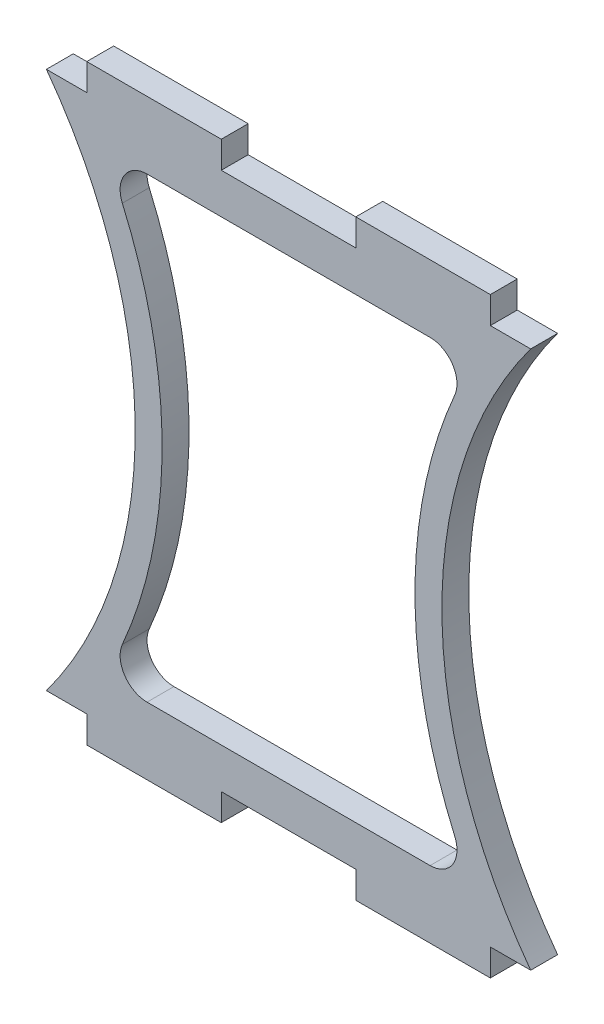
ISO-10303-21;
HEADER;
FILE_DESCRIPTION(('STEP AP214'),'2;1');
FILE_NAME('part.step','',(''),(''),'','','');
FILE_SCHEMA(('AUTOMOTIVE_DESIGN { 1 0 10303 214 1 1 1 1 }'));
ENDSEC;
DATA;
#1=APPLICATION_CONTEXT('core data for automotive mechanical design processes');
#2=APPLICATION_PROTOCOL_DEFINITION('international standard','automotive_design',2000,#1);
#3=PRODUCT_CONTEXT('',#1,'mechanical');
#4=PRODUCT('Part','Part','',(#3));
#5=PRODUCT_RELATED_PRODUCT_CATEGORY('part','',(#4));
#6=PRODUCT_DEFINITION_FORMATION('','',#4);
#7=PRODUCT_DEFINITION_CONTEXT('part definition',#1,'design');
#8=PRODUCT_DEFINITION('design','',#6,#7);
#9=PRODUCT_DEFINITION_SHAPE('','',#8);
#10=(LENGTH_UNIT() NAMED_UNIT(*) SI_UNIT(.MILLI.,.METRE.));
#11=(NAMED_UNIT(*) PLANE_ANGLE_UNIT() SI_UNIT($,.RADIAN.));
#12=(NAMED_UNIT(*) SI_UNIT($,.STERADIAN.) SOLID_ANGLE_UNIT());
#13=UNCERTAINTY_MEASURE_WITH_UNIT(LENGTH_MEASURE(1.E-05),#10,'distance_accuracy_value','');
#14=(GEOMETRIC_REPRESENTATION_CONTEXT(3) GLOBAL_UNCERTAINTY_ASSIGNED_CONTEXT((#13)) GLOBAL_UNIT_ASSIGNED_CONTEXT((#10,
#11,#12)) REPRESENTATION_CONTEXT('',''));
#15=CARTESIAN_POINT('',(0.,0.,0.));
#16=DIRECTION('',(0.,0.,1.));
#17=DIRECTION('',(1.,0.,0.));
#18=AXIS2_PLACEMENT_3D('',#15,#16,#17);
#19=CARTESIAN_POINT('',(45.,0.,2.));
#20=DIRECTION('',(0.,0.,1.));
#21=DIRECTION('',(1.,0.,0.));
#22=AXIS2_PLACEMENT_3D('',#19,#20,#21);
#23=PLANE('',#22);
#24=CARTESIAN_POINT('',(45.,0.,2.));
#25=DIRECTION('',(0.,0.,-1.));
#26=DIRECTION('',(1.,0.,0.));
#27=AXIS2_PLACEMENT_3D('',#24,#25,#26);
#28=CIRCLE('',#27,33.6005952328229);
#29=CARTESIAN_POINT('',(18.,-20.,2.));
#30=VERTEX_POINT('',#29);
#31=CARTESIAN_POINT('',(18.,20.,2.));
#32=VERTEX_POINT('',#31);
#33=EDGE_CURVE('E284',#30,#32,#28,.T.);
#34=ORIENTED_EDGE('',*,*,#33,.T.);
#35=DIRECTION('',(-1.,0.,0.));
#36=VECTOR('',#35,1.);
#37=CARTESIAN_POINT('',(15.,20.,2.));
#38=LINE('',#37,#36);
#39=CARTESIAN_POINT('',(15.,20.,2.));
#40=VERTEX_POINT('',#39);
#41=EDGE_CURVE('E287',#32,#40,#38,.T.);
#42=ORIENTED_EDGE('',*,*,#41,.T.);
#43=DIRECTION('',(0.,1.,0.));
#44=VECTOR('',#43,1.);
#45=CARTESIAN_POINT('',(15.,22.,2.));
#46=LINE('',#45,#44);
#47=CARTESIAN_POINT('',(15.,22.,2.));
#48=VERTEX_POINT('',#47);
#49=EDGE_CURVE('E290',#40,#48,#46,.T.);
#50=ORIENTED_EDGE('',*,*,#49,.T.);
#51=DIRECTION('',(-1.,0.,0.));
#52=VECTOR('',#51,1.);
#53=CARTESIAN_POINT('',(5.,22.,2.));
#54=LINE('',#53,#52);
#55=CARTESIAN_POINT('',(5.,22.,2.));
#56=VERTEX_POINT('',#55);
#57=EDGE_CURVE('E292',#48,#56,#54,.T.);
#58=ORIENTED_EDGE('',*,*,#57,.T.);
#59=DIRECTION('',(0.,-1.,0.));
#60=VECTOR('',#59,1.);
#61=CARTESIAN_POINT('',(5.,20.,2.));
#62=LINE('',#61,#60);
#63=CARTESIAN_POINT('',(5.,20.,2.));
#64=VERTEX_POINT('',#63);
#65=EDGE_CURVE('E294',#56,#64,#62,.T.);
#66=ORIENTED_EDGE('',*,*,#65,.T.);
#67=DIRECTION('',(-1.,0.,0.));
#68=VECTOR('',#67,1.);
#69=CARTESIAN_POINT('',(-5.,20.,2.));
#70=LINE('',#69,#68);
#71=CARTESIAN_POINT('',(-5.,20.,2.));
#72=VERTEX_POINT('',#71);
#73=EDGE_CURVE('E296',#64,#72,#70,.T.);
#74=ORIENTED_EDGE('',*,*,#73,.T.);
#75=DIRECTION('',(0.,1.,0.));
#76=VECTOR('',#75,1.);
#77=CARTESIAN_POINT('',(-5.,20.,2.));
#78=LINE('',#77,#76);
#79=CARTESIAN_POINT('',(-5.,22.,2.));
#80=VERTEX_POINT('',#79);
#81=EDGE_CURVE('E298',#72,#80,#78,.T.);
#82=ORIENTED_EDGE('',*,*,#81,.T.);
#83=DIRECTION('',(-1.,0.,0.));
#84=VECTOR('',#83,1.);
#85=CARTESIAN_POINT('',(-5.,22.,2.));
#86=LINE('',#85,#84);
#87=CARTESIAN_POINT('',(-15.,22.,2.));
#88=VERTEX_POINT('',#87);
#89=EDGE_CURVE('E300',#80,#88,#86,.T.);
#90=ORIENTED_EDGE('',*,*,#89,.T.);
#91=DIRECTION('',(0.,-1.,0.));
#92=VECTOR('',#91,1.);
#93=CARTESIAN_POINT('',(-15.,22.,2.));
#94=LINE('',#93,#92);
#95=CARTESIAN_POINT('',(-15.,20.,2.));
#96=VERTEX_POINT('',#95);
#97=EDGE_CURVE('E302',#88,#96,#94,.T.);
#98=ORIENTED_EDGE('',*,*,#97,.T.);
#99=DIRECTION('',(-1.,0.,0.));
#100=VECTOR('',#99,1.);
#101=CARTESIAN_POINT('',(-18.,20.,2.));
#102=LINE('',#101,#100);
#103=CARTESIAN_POINT('',(-18.,20.,2.));
#104=VERTEX_POINT('',#103);
#105=EDGE_CURVE('E304',#96,#104,#102,.T.);
#106=ORIENTED_EDGE('',*,*,#105,.T.);
#107=CARTESIAN_POINT('',(-45.,0.,2.));
#108=DIRECTION('',(0.,0.,-1.));
#109=DIRECTION('',(-1.,0.,0.));
#110=AXIS2_PLACEMENT_3D('',#107,#108,#109);
#111=CIRCLE('',#110,33.6005952328229);
#112=CARTESIAN_POINT('',(-18.,-20.,2.));
#113=VERTEX_POINT('',#112);
#114=EDGE_CURVE('E306',#104,#113,#111,.T.);
#115=ORIENTED_EDGE('',*,*,#114,.T.);
#116=DIRECTION('',(1.,0.,0.));
#117=VECTOR('',#116,1.);
#118=CARTESIAN_POINT('',(-18.,-20.,2.));
#119=LINE('',#118,#117);
#120=CARTESIAN_POINT('',(-15.,-20.,2.));
#121=VERTEX_POINT('',#120);
#122=EDGE_CURVE('E308',#113,#121,#119,.T.);
#123=ORIENTED_EDGE('',*,*,#122,.T.);
#124=DIRECTION('',(0.,-1.,0.));
#125=VECTOR('',#124,1.);
#126=CARTESIAN_POINT('',(-15.,-22.,2.));
#127=LINE('',#126,#125);
#128=CARTESIAN_POINT('',(-15.,-22.,2.));
#129=VERTEX_POINT('',#128);
#130=EDGE_CURVE('E310',#121,#129,#127,.T.);
#131=ORIENTED_EDGE('',*,*,#130,.T.);
#132=DIRECTION('',(1.,0.,0.));
#133=VECTOR('',#132,1.);
#134=CARTESIAN_POINT('',(-5.,-22.,2.));
#135=LINE('',#134,#133);
#136=CARTESIAN_POINT('',(-5.,-22.,2.));
#137=VERTEX_POINT('',#136);
#138=EDGE_CURVE('E312',#129,#137,#135,.T.);
#139=ORIENTED_EDGE('',*,*,#138,.T.);
#140=DIRECTION('',(0.,1.,0.));
#141=VECTOR('',#140,1.);
#142=CARTESIAN_POINT('',(-5.,-20.,2.));
#143=LINE('',#142,#141);
#144=CARTESIAN_POINT('',(-5.,-20.,2.));
#145=VERTEX_POINT('',#144);
#146=EDGE_CURVE('E314',#137,#145,#143,.T.);
#147=ORIENTED_EDGE('',*,*,#146,.T.);
#148=DIRECTION('',(1.,0.,0.));
#149=VECTOR('',#148,1.);
#150=CARTESIAN_POINT('',(-5.,-20.,2.));
#151=LINE('',#150,#149);
#152=CARTESIAN_POINT('',(5.,-20.,2.));
#153=VERTEX_POINT('',#152);
#154=EDGE_CURVE('E316',#145,#153,#151,.T.);
#155=ORIENTED_EDGE('',*,*,#154,.T.);
#156=DIRECTION('',(0.,-1.,0.));
#157=VECTOR('',#156,1.);
#158=CARTESIAN_POINT('',(5.,-20.,2.));
#159=LINE('',#158,#157);
#160=CARTESIAN_POINT('',(5.,-22.,2.));
#161=VERTEX_POINT('',#160);
#162=EDGE_CURVE('E318',#153,#161,#159,.T.);
#163=ORIENTED_EDGE('',*,*,#162,.T.);
#164=DIRECTION('',(1.,0.,0.));
#165=VECTOR('',#164,1.);
#166=CARTESIAN_POINT('',(5.,-22.,2.));
#167=LINE('',#166,#165);
#168=CARTESIAN_POINT('',(15.,-22.,2.));
#169=VERTEX_POINT('',#168);
#170=EDGE_CURVE('E320',#161,#169,#167,.T.);
#171=ORIENTED_EDGE('',*,*,#170,.T.);
#172=DIRECTION('',(0.,1.,0.));
#173=VECTOR('',#172,1.);
#174=CARTESIAN_POINT('',(15.,-22.,2.));
#175=LINE('',#174,#173);
#176=CARTESIAN_POINT('',(15.,-20.,2.));
#177=VERTEX_POINT('',#176);
#178=EDGE_CURVE('E322',#169,#177,#175,.T.);
#179=ORIENTED_EDGE('',*,*,#178,.T.);
#180=DIRECTION('',(1.,0.,0.));
#181=VECTOR('',#180,1.);
#182=CARTESIAN_POINT('',(15.,-20.,2.));
#183=LINE('',#182,#181);
#184=EDGE_CURVE('E324',#177,#30,#183,.T.);
#185=ORIENTED_EDGE('',*,*,#184,.T.);
#186=EDGE_LOOP('',(#34,#42,#50,#58,#66,#74,#82,#90,#98,#106,#115,#123,#131,#139,#147,#155,#163,
#171,#179,#185));
#187=FACE_BOUND('',#186,.T.);
#188=DIRECTION('',(1.,0.,0.));
#189=VECTOR('',#188,1.);
#190=CARTESIAN_POINT('',(-10.520951842277,-17.,2.));
#191=LINE('',#190,#189);
#192=CARTESIAN_POINT('',(-10.520951842277,-17.,2.));
#193=VERTEX_POINT('',#192);
#194=CARTESIAN_POINT('',(10.520951842277,-17.,2.));
#195=VERTEX_POINT('',#194);
#196=EDGE_CURVE('E227',#193,#195,#191,.T.);
#197=ORIENTED_EDGE('',*,*,#196,.F.);
#198=CARTESIAN_POINT('',(-10.520951842277,-15.,2.));
#199=DIRECTION('',(0.,0.,1.));
#200=DIRECTION('',(-1.,0.,0.));
#201=AXIS2_PLACEMENT_3D('',#198,#199,#200);
#202=CIRCLE('',#201,2.00000000000001);
#203=CARTESIAN_POINT('',(-12.3549147327168,-14.2021402902204,2.));
#204=VERTEX_POINT('',#203);
#205=EDGE_CURVE('E219',#204,#193,#202,.T.);
#206=ORIENTED_EDGE('',*,*,#205,.F.);
#207=CARTESIAN_POINT('',(-45.,0.,2.));
#208=DIRECTION('',(0.,0.,-1.));
#209=DIRECTION('',(-1.,0.,0.));
#210=AXIS2_PLACEMENT_3D('',#207,#208,#209);
#211=CIRCLE('',#210,35.6005952328229);
#212=CARTESIAN_POINT('',(-12.3549147327168,14.2021402902204,2.));
#213=VERTEX_POINT('',#212);
#214=EDGE_CURVE('E252',#213,#204,#211,.T.);
#215=ORIENTED_EDGE('',*,*,#214,.F.);
#216=CARTESIAN_POINT('',(-10.520951842277,15.,2.));
#217=DIRECTION('',(0.,0.,1.));
#218=DIRECTION('',(-1.,0.,0.));
#219=AXIS2_PLACEMENT_3D('',#216,#217,#218);
#220=CIRCLE('',#219,2.);
#221=CARTESIAN_POINT('',(-10.520951842277,17.,2.));
#222=VERTEX_POINT('',#221);
#223=EDGE_CURVE('E250',#222,#213,#220,.T.);
#224=ORIENTED_EDGE('',*,*,#223,.F.);
#225=DIRECTION('',(-1.,0.,0.));
#226=VECTOR('',#225,1.);
#227=CARTESIAN_POINT('',(-10.520951842277,17.,2.));
#228=LINE('',#227,#226);
#229=CARTESIAN_POINT('',(10.520951842277,17.,2.));
#230=VERTEX_POINT('',#229);
#231=EDGE_CURVE('E248',#230,#222,#228,.T.);
#232=ORIENTED_EDGE('',*,*,#231,.F.);
#233=CARTESIAN_POINT('',(10.520951842277,15.,2.));
#234=DIRECTION('',(0.,0.,1.));
#235=DIRECTION('',(1.,0.,0.));
#236=AXIS2_PLACEMENT_3D('',#233,#234,#235);
#237=CIRCLE('',#236,2.00000000000001);
#238=CARTESIAN_POINT('',(12.3549147327168,14.2021402902204,2.));
#239=VERTEX_POINT('',#238);
#240=EDGE_CURVE('E246',#239,#230,#237,.T.);
#241=ORIENTED_EDGE('',*,*,#240,.F.);
#242=CARTESIAN_POINT('',(45.,0.,2.));
#243=DIRECTION('',(0.,0.,-1.));
#244=DIRECTION('',(1.,0.,0.));
#245=AXIS2_PLACEMENT_3D('',#242,#243,#244);
#246=CIRCLE('',#245,35.6005952328229);
#247=CARTESIAN_POINT('',(12.3549147327168,-14.2021402902204,2.));
#248=VERTEX_POINT('',#247);
#249=EDGE_CURVE('E242',#248,#239,#246,.T.);
#250=ORIENTED_EDGE('',*,*,#249,.F.);
#251=CARTESIAN_POINT('',(10.520951842277,-15.,2.));
#252=DIRECTION('',(0.,0.,1.));
#253=DIRECTION('',(-1.,0.,0.));
#254=AXIS2_PLACEMENT_3D('',#251,#252,#253);
#255=CIRCLE('',#254,2.);
#256=EDGE_CURVE('E240',#195,#248,#255,.T.);
#257=ORIENTED_EDGE('',*,*,#256,.F.);
#258=EDGE_LOOP('',(#197,#206,#215,#224,#232,#241,#250,#257));
#259=FACE_BOUND('',#258,.T.);
#260=ADVANCED_FACE('F34',(#187,#259),#23,.T.);
#261=CARTESIAN_POINT('',(45.,0.,0.));
#262=DIRECTION('',(0.,0.,1.));
#263=DIRECTION('',(1.,0.,0.));
#264=AXIS2_PLACEMENT_3D('',#261,#262,#263);
#265=PLANE('',#264);
#266=CARTESIAN_POINT('',(45.,0.,0.));
#267=DIRECTION('',(0.,0.,-1.));
#268=DIRECTION('',(1.,0.,0.));
#269=AXIS2_PLACEMENT_3D('',#266,#267,#268);
#270=CIRCLE('',#269,33.6005952328229);
#271=CARTESIAN_POINT('',(18.,-20.,0.));
#272=VERTEX_POINT('',#271);
#273=CARTESIAN_POINT('',(18.,20.,0.));
#274=VERTEX_POINT('',#273);
#275=EDGE_CURVE('E235',#272,#274,#270,.T.);
#276=ORIENTED_EDGE('',*,*,#275,.F.);
#277=DIRECTION('',(1.,0.,0.));
#278=VECTOR('',#277,1.);
#279=CARTESIAN_POINT('',(15.,-20.,0.));
#280=LINE('',#279,#278);
#281=CARTESIAN_POINT('',(15.,-20.,0.));
#282=VERTEX_POINT('',#281);
#283=EDGE_CURVE('E288',#282,#272,#280,.T.);
#284=ORIENTED_EDGE('',*,*,#283,.F.);
#285=DIRECTION('',(0.,1.,0.));
#286=VECTOR('',#285,1.);
#287=CARTESIAN_POINT('',(15.,-22.,0.));
#288=LINE('',#287,#286);
#289=CARTESIAN_POINT('',(15.,-22.,0.));
#290=VERTEX_POINT('',#289);
#291=EDGE_CURVE('E363',#290,#282,#288,.T.);
#292=ORIENTED_EDGE('',*,*,#291,.F.);
#293=DIRECTION('',(1.,0.,0.));
#294=VECTOR('',#293,1.);
#295=CARTESIAN_POINT('',(5.,-22.,0.));
#296=LINE('',#295,#294);
#297=CARTESIAN_POINT('',(5.,-22.,0.));
#298=VERTEX_POINT('',#297);
#299=EDGE_CURVE('E361',#298,#290,#296,.T.);
#300=ORIENTED_EDGE('',*,*,#299,.F.);
#301=DIRECTION('',(0.,-1.,0.));
#302=VECTOR('',#301,1.);
#303=CARTESIAN_POINT('',(5.,-20.,0.));
#304=LINE('',#303,#302);
#305=CARTESIAN_POINT('',(5.,-20.,0.));
#306=VERTEX_POINT('',#305);
#307=EDGE_CURVE('E359',#306,#298,#304,.T.);
#308=ORIENTED_EDGE('',*,*,#307,.F.);
#309=DIRECTION('',(1.,0.,0.));
#310=VECTOR('',#309,1.);
#311=CARTESIAN_POINT('',(-5.,-20.,0.));
#312=LINE('',#311,#310);
#313=CARTESIAN_POINT('',(-5.,-20.,0.));
#314=VERTEX_POINT('',#313);
#315=EDGE_CURVE('E357',#314,#306,#312,.T.);
#316=ORIENTED_EDGE('',*,*,#315,.F.);
#317=DIRECTION('',(0.,1.,0.));
#318=VECTOR('',#317,1.);
#319=CARTESIAN_POINT('',(-5.,-20.,0.));
#320=LINE('',#319,#318);
#321=CARTESIAN_POINT('',(-5.,-22.,0.));
#322=VERTEX_POINT('',#321);
#323=EDGE_CURVE('E355',#322,#314,#320,.T.);
#324=ORIENTED_EDGE('',*,*,#323,.F.);
#325=DIRECTION('',(1.,0.,0.));
#326=VECTOR('',#325,1.);
#327=CARTESIAN_POINT('',(-5.,-22.,0.));
#328=LINE('',#327,#326);
#329=CARTESIAN_POINT('',(-15.,-22.,0.));
#330=VERTEX_POINT('',#329);
#331=EDGE_CURVE('E353',#330,#322,#328,.T.);
#332=ORIENTED_EDGE('',*,*,#331,.F.);
#333=DIRECTION('',(0.,-1.,0.));
#334=VECTOR('',#333,1.);
#335=CARTESIAN_POINT('',(-15.,-22.,0.));
#336=LINE('',#335,#334);
#337=CARTESIAN_POINT('',(-15.,-20.,0.));
#338=VERTEX_POINT('',#337);
#339=EDGE_CURVE('E351',#338,#330,#336,.T.);
#340=ORIENTED_EDGE('',*,*,#339,.F.);
#341=DIRECTION('',(1.,0.,0.));
#342=VECTOR('',#341,1.);
#343=CARTESIAN_POINT('',(-18.,-20.,0.));
#344=LINE('',#343,#342);
#345=CARTESIAN_POINT('',(-18.,-20.,0.));
#346=VERTEX_POINT('',#345);
#347=EDGE_CURVE('E349',#346,#338,#344,.T.);
#348=ORIENTED_EDGE('',*,*,#347,.F.);
#349=CARTESIAN_POINT('',(-45.,0.,0.));
#350=DIRECTION('',(0.,0.,-1.));
#351=DIRECTION('',(-1.,0.,0.));
#352=AXIS2_PLACEMENT_3D('',#349,#350,#351);
#353=CIRCLE('',#352,33.6005952328229);
#354=CARTESIAN_POINT('',(-18.,20.,0.));
#355=VERTEX_POINT('',#354);
#356=EDGE_CURVE('E347',#355,#346,#353,.T.);
#357=ORIENTED_EDGE('',*,*,#356,.F.);
#358=DIRECTION('',(-1.,0.,0.));
#359=VECTOR('',#358,1.);
#360=CARTESIAN_POINT('',(-18.,20.,0.));
#361=LINE('',#360,#359);
#362=CARTESIAN_POINT('',(-15.,20.,0.));
#363=VERTEX_POINT('',#362);
#364=EDGE_CURVE('E345',#363,#355,#361,.T.);
#365=ORIENTED_EDGE('',*,*,#364,.F.);
#366=DIRECTION('',(0.,-1.,0.));
#367=VECTOR('',#366,1.);
#368=CARTESIAN_POINT('',(-15.,22.,0.));
#369=LINE('',#368,#367);
#370=CARTESIAN_POINT('',(-15.,22.,0.));
#371=VERTEX_POINT('',#370);
#372=EDGE_CURVE('E343',#371,#363,#369,.T.);
#373=ORIENTED_EDGE('',*,*,#372,.F.);
#374=DIRECTION('',(-1.,0.,0.));
#375=VECTOR('',#374,1.);
#376=CARTESIAN_POINT('',(-5.,22.,0.));
#377=LINE('',#376,#375);
#378=CARTESIAN_POINT('',(-5.,22.,0.));
#379=VERTEX_POINT('',#378);
#380=EDGE_CURVE('E341',#379,#371,#377,.T.);
#381=ORIENTED_EDGE('',*,*,#380,.F.);
#382=DIRECTION('',(0.,1.,0.));
#383=VECTOR('',#382,1.);
#384=CARTESIAN_POINT('',(-5.,20.,0.));
#385=LINE('',#384,#383);
#386=CARTESIAN_POINT('',(-5.,20.,0.));
#387=VERTEX_POINT('',#386);
#388=EDGE_CURVE('E339',#387,#379,#385,.T.);
#389=ORIENTED_EDGE('',*,*,#388,.F.);
#390=DIRECTION('',(-1.,0.,0.));
#391=VECTOR('',#390,1.);
#392=CARTESIAN_POINT('',(-5.,20.,0.));
#393=LINE('',#392,#391);
#394=CARTESIAN_POINT('',(5.,20.,0.));
#395=VERTEX_POINT('',#394);
#396=EDGE_CURVE('E337',#395,#387,#393,.T.);
#397=ORIENTED_EDGE('',*,*,#396,.F.);
#398=DIRECTION('',(0.,-1.,0.));
#399=VECTOR('',#398,1.);
#400=CARTESIAN_POINT('',(5.,20.,0.));
#401=LINE('',#400,#399);
#402=CARTESIAN_POINT('',(5.,22.,0.));
#403=VERTEX_POINT('',#402);
#404=EDGE_CURVE('E335',#403,#395,#401,.T.);
#405=ORIENTED_EDGE('',*,*,#404,.F.);
#406=DIRECTION('',(-1.,0.,0.));
#407=VECTOR('',#406,1.);
#408=CARTESIAN_POINT('',(5.,22.,0.));
#409=LINE('',#408,#407);
#410=CARTESIAN_POINT('',(15.,22.,0.));
#411=VERTEX_POINT('',#410);
#412=EDGE_CURVE('E333',#411,#403,#409,.T.);
#413=ORIENTED_EDGE('',*,*,#412,.F.);
#414=DIRECTION('',(0.,1.,0.));
#415=VECTOR('',#414,1.);
#416=CARTESIAN_POINT('',(15.,22.,0.));
#417=LINE('',#416,#415);
#418=CARTESIAN_POINT('',(15.,20.,0.));
#419=VERTEX_POINT('',#418);
#420=EDGE_CURVE('E331',#419,#411,#417,.T.);
#421=ORIENTED_EDGE('',*,*,#420,.F.);
#422=DIRECTION('',(-1.,0.,0.));
#423=VECTOR('',#422,1.);
#424=CARTESIAN_POINT('',(15.,20.,0.));
#425=LINE('',#424,#423);
#426=EDGE_CURVE('E329',#274,#419,#425,.T.);
#427=ORIENTED_EDGE('',*,*,#426,.F.);
#428=EDGE_LOOP('',(#276,#284,#292,#300,#308,#316,#324,#332,#340,#348,#357,#365,#373,#381,#389,
#397,#405,#413,#421,#427));
#429=FACE_BOUND('',#428,.T.);
#430=CARTESIAN_POINT('',(-10.520951842277,-15.,0.));
#431=DIRECTION('',(0.,0.,1.));
#432=DIRECTION('',(-1.,0.,0.));
#433=AXIS2_PLACEMENT_3D('',#430,#431,#432);
#434=CIRCLE('',#433,2.00000000000001);
#435=CARTESIAN_POINT('',(-12.3549147327168,-14.2021402902204,0.));
#436=VERTEX_POINT('',#435);
#437=CARTESIAN_POINT('',(-10.520951842277,-17.,0.));
#438=VERTEX_POINT('',#437);
#439=EDGE_CURVE('E57',#436,#438,#434,.T.);
#440=ORIENTED_EDGE('',*,*,#439,.T.);
#441=DIRECTION('',(1.,0.,0.));
#442=VECTOR('',#441,1.);
#443=CARTESIAN_POINT('',(-10.520951842277,-17.,0.));
#444=LINE('',#443,#442);
#445=CARTESIAN_POINT('',(10.520951842277,-17.,0.));
#446=VERTEX_POINT('',#445);
#447=EDGE_CURVE('E234',#438,#446,#444,.T.);
#448=ORIENTED_EDGE('',*,*,#447,.T.);
#449=CARTESIAN_POINT('',(10.520951842277,-15.,0.));
#450=DIRECTION('',(0.,0.,1.));
#451=DIRECTION('',(-1.,0.,0.));
#452=AXIS2_PLACEMENT_3D('',#449,#450,#451);
#453=CIRCLE('',#452,2.);
#454=CARTESIAN_POINT('',(12.3549147327168,-14.2021402902204,0.));
#455=VERTEX_POINT('',#454);
#456=EDGE_CURVE('E256',#446,#455,#453,.T.);
#457=ORIENTED_EDGE('',*,*,#456,.T.);
#458=CARTESIAN_POINT('',(45.,0.,0.));
#459=DIRECTION('',(0.,0.,-1.));
#460=DIRECTION('',(1.,0.,0.));
#461=AXIS2_PLACEMENT_3D('',#458,#459,#460);
#462=CIRCLE('',#461,35.6005952328229);
#463=CARTESIAN_POINT('',(12.3549147327168,14.2021402902204,0.));
#464=VERTEX_POINT('',#463);
#465=EDGE_CURVE('E259',#455,#464,#462,.T.);
#466=ORIENTED_EDGE('',*,*,#465,.T.);
#467=CARTESIAN_POINT('',(10.520951842277,15.,0.));
#468=DIRECTION('',(0.,0.,1.));
#469=DIRECTION('',(1.,0.,0.));
#470=AXIS2_PLACEMENT_3D('',#467,#468,#469);
#471=CIRCLE('',#470,2.00000000000001);
#472=CARTESIAN_POINT('',(10.520951842277,17.,0.));
#473=VERTEX_POINT('',#472);
#474=EDGE_CURVE('E262',#464,#473,#471,.T.);
#475=ORIENTED_EDGE('',*,*,#474,.T.);
#476=DIRECTION('',(-1.,0.,0.));
#477=VECTOR('',#476,1.);
#478=CARTESIAN_POINT('',(-10.520951842277,17.,0.));
#479=LINE('',#478,#477);
#480=CARTESIAN_POINT('',(-10.520951842277,17.,0.));
#481=VERTEX_POINT('',#480);
#482=EDGE_CURVE('E265',#473,#481,#479,.T.);
#483=ORIENTED_EDGE('',*,*,#482,.T.);
#484=CARTESIAN_POINT('',(-10.520951842277,15.,0.));
#485=DIRECTION('',(0.,0.,1.));
#486=DIRECTION('',(-1.,0.,0.));
#487=AXIS2_PLACEMENT_3D('',#484,#485,#486);
#488=CIRCLE('',#487,2.);
#489=CARTESIAN_POINT('',(-12.3549147327168,14.2021402902204,0.));
#490=VERTEX_POINT('',#489);
#491=EDGE_CURVE('E268',#481,#490,#488,.T.);
#492=ORIENTED_EDGE('',*,*,#491,.T.);
#493=CARTESIAN_POINT('',(-45.,0.,0.));
#494=DIRECTION('',(0.,0.,-1.));
#495=DIRECTION('',(-1.,0.,0.));
#496=AXIS2_PLACEMENT_3D('',#493,#494,#495);
#497=CIRCLE('',#496,35.6005952328229);
#498=EDGE_CURVE('E228',#490,#436,#497,.T.);
#499=ORIENTED_EDGE('',*,*,#498,.T.);
#500=EDGE_LOOP('',(#440,#448,#457,#466,#475,#483,#492,#499));
#501=FACE_BOUND('',#500,.T.);
#502=ADVANCED_FACE('F429',(#429,#501),#265,.F.);
#503=CARTESIAN_POINT('',(45.,0.,2.));
#504=DIRECTION('',(0.,0.,-1.));
#505=DIRECTION('',(-1.,0.,0.));
#506=AXIS2_PLACEMENT_3D('',#503,#504,#505);
#507=CYLINDRICAL_SURFACE('',#506,33.6005952328229);
#508=ORIENTED_EDGE('',*,*,#275,.T.);
#509=DIRECTION('',(0.,0.,-1.));
#510=VECTOR('',#509,1.);
#511=CARTESIAN_POINT('',(18.,20.,2.));
#512=LINE('',#511,#510);
#513=EDGE_CURVE('E11',#32,#274,#512,.T.);
#514=ORIENTED_EDGE('',*,*,#513,.F.);
#515=ORIENTED_EDGE('',*,*,#33,.F.);
#516=DIRECTION('',(0.,0.,-1.));
#517=VECTOR('',#516,1.);
#518=CARTESIAN_POINT('',(18.,-20.,2.));
#519=LINE('',#518,#517);
#520=EDGE_CURVE('E326',#30,#272,#519,.T.);
#521=ORIENTED_EDGE('',*,*,#520,.T.);
#522=EDGE_LOOP('',(#508,#514,#515,#521));
#523=FACE_BOUND('',#522,.T.);
#524=ADVANCED_FACE('F36',(#523),#507,.F.);
#525=CARTESIAN_POINT('',(15.,20.,2.));
#526=DIRECTION('',(0.,-1.,0.));
#527=DIRECTION('',(0.,0.,-1.));
#528=AXIS2_PLACEMENT_3D('',#525,#526,#527);
#529=PLANE('',#528);
#530=ORIENTED_EDGE('',*,*,#426,.T.);
#531=DIRECTION('',(0.,0.,-1.));
#532=VECTOR('',#531,1.);
#533=CARTESIAN_POINT('',(15.,20.,2.));
#534=LINE('',#533,#532);
#535=EDGE_CURVE('E42',#40,#419,#534,.T.);
#536=ORIENTED_EDGE('',*,*,#535,.F.);
#537=ORIENTED_EDGE('',*,*,#41,.F.);
#538=ORIENTED_EDGE('',*,*,#513,.T.);
#539=EDGE_LOOP('',(#530,#536,#537,#538));
#540=FACE_BOUND('',#539,.T.);
#541=ADVANCED_FACE('F446',(#540),#529,.F.);
#542=CARTESIAN_POINT('',(15.,22.,2.));
#543=DIRECTION('',(-1.,0.,0.));
#544=DIRECTION('',(0.,0.,1.));
#545=AXIS2_PLACEMENT_3D('',#542,#543,#544);
#546=PLANE('',#545);
#547=ORIENTED_EDGE('',*,*,#420,.T.);
#548=DIRECTION('',(0.,0.,-1.));
#549=VECTOR('',#548,1.);
#550=CARTESIAN_POINT('',(15.,22.,2.));
#551=LINE('',#550,#549);
#552=EDGE_CURVE('E416',#48,#411,#551,.T.);
#553=ORIENTED_EDGE('',*,*,#552,.F.);
#554=ORIENTED_EDGE('',*,*,#49,.F.);
#555=ORIENTED_EDGE('',*,*,#535,.T.);
#556=EDGE_LOOP('',(#547,#553,#554,#555));
#557=FACE_BOUND('',#556,.T.);
#558=ADVANCED_FACE('F423',(#557),#546,.F.);
#559=CARTESIAN_POINT('',(5.,22.,2.));
#560=DIRECTION('',(0.,-1.,0.));
#561=DIRECTION('',(0.,0.,-1.));
#562=AXIS2_PLACEMENT_3D('',#559,#560,#561);
#563=PLANE('',#562);
#564=ORIENTED_EDGE('',*,*,#412,.T.);
#565=DIRECTION('',(0.,0.,-1.));
#566=VECTOR('',#565,1.);
#567=CARTESIAN_POINT('',(5.,22.,2.));
#568=LINE('',#567,#566);
#569=EDGE_CURVE('E413',#56,#403,#568,.T.);
#570=ORIENTED_EDGE('',*,*,#569,.F.);
#571=ORIENTED_EDGE('',*,*,#57,.F.);
#572=ORIENTED_EDGE('',*,*,#552,.T.);
#573=EDGE_LOOP('',(#564,#570,#571,#572));
#574=FACE_BOUND('',#573,.T.);
#575=ADVANCED_FACE('F435',(#574),#563,.F.);
#576=CARTESIAN_POINT('',(5.,20.,2.));
#577=DIRECTION('',(1.,0.,0.));
#578=DIRECTION('',(0.,0.,-1.));
#579=AXIS2_PLACEMENT_3D('',#576,#577,#578);
#580=PLANE('',#579);
#581=ORIENTED_EDGE('',*,*,#404,.T.);
#582=DIRECTION('',(0.,0.,-1.));
#583=VECTOR('',#582,1.);
#584=CARTESIAN_POINT('',(5.,20.,2.));
#585=LINE('',#584,#583);
#586=EDGE_CURVE('E410',#64,#395,#585,.T.);
#587=ORIENTED_EDGE('',*,*,#586,.F.);
#588=ORIENTED_EDGE('',*,*,#65,.F.);
#589=ORIENTED_EDGE('',*,*,#569,.T.);
#590=EDGE_LOOP('',(#581,#587,#588,#589));
#591=FACE_BOUND('',#590,.T.);
#592=ADVANCED_FACE('F439',(#591),#580,.F.);
#593=CARTESIAN_POINT('',(-5.,20.,2.));
#594=DIRECTION('',(0.,-1.,0.));
#595=DIRECTION('',(0.,0.,-1.));
#596=AXIS2_PLACEMENT_3D('',#593,#594,#595);
#597=PLANE('',#596);
#598=ORIENTED_EDGE('',*,*,#396,.T.);
#599=DIRECTION('',(0.,0.,-1.));
#600=VECTOR('',#599,1.);
#601=CARTESIAN_POINT('',(-5.,20.,2.));
#602=LINE('',#601,#600);
#603=EDGE_CURVE('E407',#72,#387,#602,.T.);
#604=ORIENTED_EDGE('',*,*,#603,.F.);
#605=ORIENTED_EDGE('',*,*,#73,.F.);
#606=ORIENTED_EDGE('',*,*,#586,.T.);
#607=EDGE_LOOP('',(#598,#604,#605,#606));
#608=FACE_BOUND('',#607,.T.);
#609=ADVANCED_FACE('F519',(#608),#597,.F.);
#610=CARTESIAN_POINT('',(-5.,20.,2.));
#611=DIRECTION('',(-1.,0.,0.));
#612=DIRECTION('',(0.,0.,1.));
#613=AXIS2_PLACEMENT_3D('',#610,#611,#612);
#614=PLANE('',#613);
#615=ORIENTED_EDGE('',*,*,#388,.T.);
#616=DIRECTION('',(0.,0.,-1.));
#617=VECTOR('',#616,1.);
#618=CARTESIAN_POINT('',(-5.,22.,2.));
#619=LINE('',#618,#617);
#620=EDGE_CURVE('E404',#80,#379,#619,.T.);
#621=ORIENTED_EDGE('',*,*,#620,.F.);
#622=ORIENTED_EDGE('',*,*,#81,.F.);
#623=ORIENTED_EDGE('',*,*,#603,.T.);
#624=EDGE_LOOP('',(#615,#621,#622,#623));
#625=FACE_BOUND('',#624,.T.);
#626=ADVANCED_FACE('F517',(#625),#614,.F.);
#627=CARTESIAN_POINT('',(-5.,22.,2.));
#628=DIRECTION('',(0.,-1.,0.));
#629=DIRECTION('',(0.,0.,-1.));
#630=AXIS2_PLACEMENT_3D('',#627,#628,#629);
#631=PLANE('',#630);
#632=ORIENTED_EDGE('',*,*,#380,.T.);
#633=DIRECTION('',(0.,0.,-1.));
#634=VECTOR('',#633,1.);
#635=CARTESIAN_POINT('',(-15.,22.,2.));
#636=LINE('',#635,#634);
#637=EDGE_CURVE('E401',#88,#371,#636,.T.);
#638=ORIENTED_EDGE('',*,*,#637,.F.);
#639=ORIENTED_EDGE('',*,*,#89,.F.);
#640=ORIENTED_EDGE('',*,*,#620,.T.);
#641=EDGE_LOOP('',(#632,#638,#639,#640));
#642=FACE_BOUND('',#641,.T.);
#643=ADVANCED_FACE('F512',(#642),#631,.F.);
#644=CARTESIAN_POINT('',(-15.,22.,2.));
#645=DIRECTION('',(1.,0.,0.));
#646=DIRECTION('',(0.,0.,-1.));
#647=AXIS2_PLACEMENT_3D('',#644,#645,#646);
#648=PLANE('',#647);
#649=ORIENTED_EDGE('',*,*,#372,.T.);
#650=DIRECTION('',(0.,0.,-1.));
#651=VECTOR('',#650,1.);
#652=CARTESIAN_POINT('',(-15.,20.,2.));
#653=LINE('',#652,#651);
#654=EDGE_CURVE('E398',#96,#363,#653,.T.);
#655=ORIENTED_EDGE('',*,*,#654,.F.);
#656=ORIENTED_EDGE('',*,*,#97,.F.);
#657=ORIENTED_EDGE('',*,*,#637,.T.);
#658=EDGE_LOOP('',(#649,#655,#656,#657));
#659=FACE_BOUND('',#658,.T.);
#660=ADVANCED_FACE('F507',(#659),#648,.F.);
#661=CARTESIAN_POINT('',(-18.,20.,2.));
#662=DIRECTION('',(0.,-1.,0.));
#663=DIRECTION('',(0.,0.,-1.));
#664=AXIS2_PLACEMENT_3D('',#661,#662,#663);
#665=PLANE('',#664);
#666=ORIENTED_EDGE('',*,*,#364,.T.);
#667=DIRECTION('',(0.,0.,-1.));
#668=VECTOR('',#667,1.);
#669=CARTESIAN_POINT('',(-18.,20.,2.));
#670=LINE('',#669,#668);
#671=EDGE_CURVE('E395',#104,#355,#670,.T.);
#672=ORIENTED_EDGE('',*,*,#671,.F.);
#673=ORIENTED_EDGE('',*,*,#105,.F.);
#674=ORIENTED_EDGE('',*,*,#654,.T.);
#675=EDGE_LOOP('',(#666,#672,#673,#674));
#676=FACE_BOUND('',#675,.T.);
#677=ADVANCED_FACE('F503',(#676),#665,.F.);
#678=CARTESIAN_POINT('',(-45.,0.,2.));
#679=DIRECTION('',(0.,0.,-1.));
#680=DIRECTION('',(-1.,0.,0.));
#681=AXIS2_PLACEMENT_3D('',#678,#679,#680);
#682=CYLINDRICAL_SURFACE('',#681,33.6005952328229);
#683=ORIENTED_EDGE('',*,*,#356,.T.);
#684=DIRECTION('',(0.,0.,-1.));
#685=VECTOR('',#684,1.);
#686=CARTESIAN_POINT('',(-18.,-20.,2.));
#687=LINE('',#686,#685);
#688=EDGE_CURVE('E392',#113,#346,#687,.T.);
#689=ORIENTED_EDGE('',*,*,#688,.F.);
#690=ORIENTED_EDGE('',*,*,#114,.F.);
#691=ORIENTED_EDGE('',*,*,#671,.T.);
#692=EDGE_LOOP('',(#683,#689,#690,#691));
#693=FACE_BOUND('',#692,.T.);
#694=ADVANCED_FACE('F498',(#693),#682,.F.);
#695=CARTESIAN_POINT('',(-18.,-20.,2.));
#696=DIRECTION('',(0.,1.,0.));
#697=DIRECTION('',(0.,0.,1.));
#698=AXIS2_PLACEMENT_3D('',#695,#696,#697);
#699=PLANE('',#698);
#700=ORIENTED_EDGE('',*,*,#347,.T.);
#701=DIRECTION('',(0.,0.,-1.));
#702=VECTOR('',#701,1.);
#703=CARTESIAN_POINT('',(-15.,-20.,2.));
#704=LINE('',#703,#702);
#705=EDGE_CURVE('E389',#121,#338,#704,.T.);
#706=ORIENTED_EDGE('',*,*,#705,.F.);
#707=ORIENTED_EDGE('',*,*,#122,.F.);
#708=ORIENTED_EDGE('',*,*,#688,.T.);
#709=EDGE_LOOP('',(#700,#706,#707,#708));
#710=FACE_BOUND('',#709,.T.);
#711=ADVANCED_FACE('F492',(#710),#699,.F.);
#712=CARTESIAN_POINT('',(-15.,-22.,2.));
#713=DIRECTION('',(1.,0.,0.));
#714=DIRECTION('',(0.,0.,-1.));
#715=AXIS2_PLACEMENT_3D('',#712,#713,#714);
#716=PLANE('',#715);
#717=ORIENTED_EDGE('',*,*,#339,.T.);
#718=DIRECTION('',(0.,0.,-1.));
#719=VECTOR('',#718,1.);
#720=CARTESIAN_POINT('',(-15.,-22.,2.));
#721=LINE('',#720,#719);
#722=EDGE_CURVE('E386',#129,#330,#721,.T.);
#723=ORIENTED_EDGE('',*,*,#722,.F.);
#724=ORIENTED_EDGE('',*,*,#130,.F.);
#725=ORIENTED_EDGE('',*,*,#705,.T.);
#726=EDGE_LOOP('',(#717,#723,#724,#725));
#727=FACE_BOUND('',#726,.T.);
#728=ADVANCED_FACE('F488',(#727),#716,.F.);
#729=CARTESIAN_POINT('',(-5.,-22.,2.));
#730=DIRECTION('',(0.,1.,0.));
#731=DIRECTION('',(0.,0.,1.));
#732=AXIS2_PLACEMENT_3D('',#729,#730,#731);
#733=PLANE('',#732);
#734=ORIENTED_EDGE('',*,*,#331,.T.);
#735=DIRECTION('',(0.,0.,-1.));
#736=VECTOR('',#735,1.);
#737=CARTESIAN_POINT('',(-5.,-22.,2.));
#738=LINE('',#737,#736);
#739=EDGE_CURVE('E383',#137,#322,#738,.T.);
#740=ORIENTED_EDGE('',*,*,#739,.F.);
#741=ORIENTED_EDGE('',*,*,#138,.F.);
#742=ORIENTED_EDGE('',*,*,#722,.T.);
#743=EDGE_LOOP('',(#734,#740,#741,#742));
#744=FACE_BOUND('',#743,.T.);
#745=ADVANCED_FACE('F483',(#744),#733,.F.);
#746=CARTESIAN_POINT('',(-5.,-20.,2.));
#747=DIRECTION('',(-1.,0.,0.));
#748=DIRECTION('',(0.,0.,1.));
#749=AXIS2_PLACEMENT_3D('',#746,#747,#748);
#750=PLANE('',#749);
#751=ORIENTED_EDGE('',*,*,#323,.T.);
#752=DIRECTION('',(0.,0.,-1.));
#753=VECTOR('',#752,1.);
#754=CARTESIAN_POINT('',(-5.,-20.,2.));
#755=LINE('',#754,#753);
#756=EDGE_CURVE('E380',#145,#314,#755,.T.);
#757=ORIENTED_EDGE('',*,*,#756,.F.);
#758=ORIENTED_EDGE('',*,*,#146,.F.);
#759=ORIENTED_EDGE('',*,*,#739,.T.);
#760=EDGE_LOOP('',(#751,#757,#758,#759));
#761=FACE_BOUND('',#760,.T.);
#762=ADVANCED_FACE('F477',(#761),#750,.F.);
#763=CARTESIAN_POINT('',(-5.,-20.,2.));
#764=DIRECTION('',(0.,1.,0.));
#765=DIRECTION('',(0.,0.,1.));
#766=AXIS2_PLACEMENT_3D('',#763,#764,#765);
#767=PLANE('',#766);
#768=ORIENTED_EDGE('',*,*,#315,.T.);
#769=DIRECTION('',(0.,0.,-1.));
#770=VECTOR('',#769,1.);
#771=CARTESIAN_POINT('',(5.,-20.,2.));
#772=LINE('',#771,#770);
#773=EDGE_CURVE('E377',#153,#306,#772,.T.);
#774=ORIENTED_EDGE('',*,*,#773,.F.);
#775=ORIENTED_EDGE('',*,*,#154,.F.);
#776=ORIENTED_EDGE('',*,*,#756,.T.);
#777=EDGE_LOOP('',(#768,#774,#775,#776));
#778=FACE_BOUND('',#777,.T.);
#779=ADVANCED_FACE('F473',(#778),#767,.F.);
#780=CARTESIAN_POINT('',(5.,-20.,2.));
#781=DIRECTION('',(1.,0.,0.));
#782=DIRECTION('',(0.,0.,-1.));
#783=AXIS2_PLACEMENT_3D('',#780,#781,#782);
#784=PLANE('',#783);
#785=ORIENTED_EDGE('',*,*,#307,.T.);
#786=DIRECTION('',(0.,0.,-1.));
#787=VECTOR('',#786,1.);
#788=CARTESIAN_POINT('',(5.,-22.,2.));
#789=LINE('',#788,#787);
#790=EDGE_CURVE('E374',#161,#298,#789,.T.);
#791=ORIENTED_EDGE('',*,*,#790,.F.);
#792=ORIENTED_EDGE('',*,*,#162,.F.);
#793=ORIENTED_EDGE('',*,*,#773,.T.);
#794=EDGE_LOOP('',(#785,#791,#792,#793));
#795=FACE_BOUND('',#794,.T.);
#796=ADVANCED_FACE('F468',(#795),#784,.F.);
#797=CARTESIAN_POINT('',(5.,-22.,2.));
#798=DIRECTION('',(0.,1.,0.));
#799=DIRECTION('',(0.,0.,1.));
#800=AXIS2_PLACEMENT_3D('',#797,#798,#799);
#801=PLANE('',#800);
#802=ORIENTED_EDGE('',*,*,#299,.T.);
#803=DIRECTION('',(0.,0.,-1.));
#804=VECTOR('',#803,1.);
#805=CARTESIAN_POINT('',(15.,-22.,2.));
#806=LINE('',#805,#804);
#807=EDGE_CURVE('E371',#169,#290,#806,.T.);
#808=ORIENTED_EDGE('',*,*,#807,.F.);
#809=ORIENTED_EDGE('',*,*,#170,.F.);
#810=ORIENTED_EDGE('',*,*,#790,.T.);
#811=EDGE_LOOP('',(#802,#808,#809,#810));
#812=FACE_BOUND('',#811,.T.);
#813=ADVANCED_FACE('F462',(#812),#801,.F.);
#814=CARTESIAN_POINT('',(15.,-22.,2.));
#815=DIRECTION('',(-1.,0.,0.));
#816=DIRECTION('',(0.,0.,1.));
#817=AXIS2_PLACEMENT_3D('',#814,#815,#816);
#818=PLANE('',#817);
#819=ORIENTED_EDGE('',*,*,#291,.T.);
#820=DIRECTION('',(0.,0.,-1.));
#821=VECTOR('',#820,1.);
#822=CARTESIAN_POINT('',(15.,-20.,2.));
#823=LINE('',#822,#821);
#824=EDGE_CURVE('E368',#177,#282,#823,.T.);
#825=ORIENTED_EDGE('',*,*,#824,.F.);
#826=ORIENTED_EDGE('',*,*,#178,.F.);
#827=ORIENTED_EDGE('',*,*,#807,.T.);
#828=EDGE_LOOP('',(#819,#825,#826,#827));
#829=FACE_BOUND('',#828,.T.);
#830=ADVANCED_FACE('F458',(#829),#818,.F.);
#831=CARTESIAN_POINT('',(15.,-20.,2.));
#832=DIRECTION('',(0.,1.,0.));
#833=DIRECTION('',(0.,0.,1.));
#834=AXIS2_PLACEMENT_3D('',#831,#832,#833);
#835=PLANE('',#834);
#836=ORIENTED_EDGE('',*,*,#283,.T.);
#837=ORIENTED_EDGE('',*,*,#520,.F.);
#838=ORIENTED_EDGE('',*,*,#184,.F.);
#839=ORIENTED_EDGE('',*,*,#824,.T.);
#840=EDGE_LOOP('',(#836,#837,#838,#839));
#841=FACE_BOUND('',#840,.T.);
#842=ADVANCED_FACE('F453',(#841),#835,.F.);
#843=CARTESIAN_POINT('',(-10.520951842277,-15.,2.));
#844=DIRECTION('',(0.,0.,-1.));
#845=DIRECTION('',(-1.,0.,0.));
#846=AXIS2_PLACEMENT_3D('',#843,#844,#845);
#847=CYLINDRICAL_SURFACE('',#846,2.00000000000001);
#848=ORIENTED_EDGE('',*,*,#439,.F.);
#849=DIRECTION('',(0.,0.,-1.));
#850=VECTOR('',#849,1.);
#851=CARTESIAN_POINT('',(-12.3549147327168,-14.2021402902204,2.));
#852=LINE('',#851,#850);
#853=EDGE_CURVE('E223',#204,#436,#852,.T.);
#854=ORIENTED_EDGE('',*,*,#853,.F.);
#855=ORIENTED_EDGE('',*,*,#205,.T.);
#856=DIRECTION('',(0.,0.,-1.));
#857=VECTOR('',#856,1.);
#858=CARTESIAN_POINT('',(-10.520951842277,-17.,2.));
#859=LINE('',#858,#857);
#860=EDGE_CURVE('E222',#193,#438,#859,.T.);
#861=ORIENTED_EDGE('',*,*,#860,.T.);
#862=EDGE_LOOP('',(#848,#854,#855,#861));
#863=FACE_BOUND('',#862,.T.);
#864=ADVANCED_FACE('F221',(#863),#847,.F.);
#865=CARTESIAN_POINT('',(-10.520951842277,-17.,2.));
#866=DIRECTION('',(0.,1.,0.));
#867=DIRECTION('',(-1.,0.,0.));
#868=AXIS2_PLACEMENT_3D('',#865,#866,#867);
#869=PLANE('',#868);
#870=ORIENTED_EDGE('',*,*,#447,.F.);
#871=ORIENTED_EDGE('',*,*,#860,.F.);
#872=ORIENTED_EDGE('',*,*,#196,.T.);
#873=DIRECTION('',(0.,0.,-1.));
#874=VECTOR('',#873,1.);
#875=CARTESIAN_POINT('',(10.520951842277,-17.,2.));
#876=LINE('',#875,#874);
#877=EDGE_CURVE('E236',#195,#446,#876,.T.);
#878=ORIENTED_EDGE('',*,*,#877,.T.);
#879=EDGE_LOOP('',(#870,#871,#872,#878));
#880=FACE_BOUND('',#879,.T.);
#881=ADVANCED_FACE('F231',(#880),#869,.T.);
#882=CARTESIAN_POINT('',(10.520951842277,-15.,2.));
#883=DIRECTION('',(0.,0.,-1.));
#884=DIRECTION('',(-1.,0.,0.));
#885=AXIS2_PLACEMENT_3D('',#882,#883,#884);
#886=CYLINDRICAL_SURFACE('',#885,2.);
#887=ORIENTED_EDGE('',*,*,#456,.F.);
#888=ORIENTED_EDGE('',*,*,#877,.F.);
#889=ORIENTED_EDGE('',*,*,#256,.T.);
#890=DIRECTION('',(0.,0.,-1.));
#891=VECTOR('',#890,1.);
#892=CARTESIAN_POINT('',(12.3549147327168,-14.2021402902204,2.));
#893=LINE('',#892,#891);
#894=EDGE_CURVE('E281',#248,#455,#893,.T.);
#895=ORIENTED_EDGE('',*,*,#894,.T.);
#896=EDGE_LOOP('',(#887,#888,#889,#895));
#897=FACE_BOUND('',#896,.T.);
#898=ADVANCED_FACE('F625',(#897),#886,.F.);
#899=CARTESIAN_POINT('',(45.,0.,2.));
#900=DIRECTION('',(0.,0.,-1.));
#901=DIRECTION('',(-1.,0.,0.));
#902=AXIS2_PLACEMENT_3D('',#899,#900,#901);
#903=CYLINDRICAL_SURFACE('',#902,35.6005952328229);
#904=ORIENTED_EDGE('',*,*,#465,.F.);
#905=ORIENTED_EDGE('',*,*,#894,.F.);
#906=ORIENTED_EDGE('',*,*,#249,.T.);
#907=DIRECTION('',(0.,0.,-1.));
#908=VECTOR('',#907,1.);
#909=CARTESIAN_POINT('',(12.3549147327168,14.2021402902204,2.));
#910=LINE('',#909,#908);
#911=EDGE_CURVE('E279',#239,#464,#910,.T.);
#912=ORIENTED_EDGE('',*,*,#911,.T.);
#913=EDGE_LOOP('',(#904,#905,#906,#912));
#914=FACE_BOUND('',#913,.T.);
#915=ADVANCED_FACE('F631',(#914),#903,.T.);
#916=CARTESIAN_POINT('',(10.520951842277,15.,2.));
#917=DIRECTION('',(0.,0.,-1.));
#918=DIRECTION('',(-1.,0.,0.));
#919=AXIS2_PLACEMENT_3D('',#916,#917,#918);
#920=CYLINDRICAL_SURFACE('',#919,2.00000000000001);
#921=ORIENTED_EDGE('',*,*,#474,.F.);
#922=ORIENTED_EDGE('',*,*,#911,.F.);
#923=ORIENTED_EDGE('',*,*,#240,.T.);
#924=DIRECTION('',(0.,0.,-1.));
#925=VECTOR('',#924,1.);
#926=CARTESIAN_POINT('',(10.520951842277,17.,2.));
#927=LINE('',#926,#925);
#928=EDGE_CURVE('E277',#230,#473,#927,.T.);
#929=ORIENTED_EDGE('',*,*,#928,.T.);
#930=EDGE_LOOP('',(#921,#922,#923,#929));
#931=FACE_BOUND('',#930,.T.);
#932=ADVANCED_FACE('F639',(#931),#920,.F.);
#933=CARTESIAN_POINT('',(-10.520951842277,17.,2.));
#934=DIRECTION('',(0.,-1.,0.));
#935=DIRECTION('',(1.,0.,0.));
#936=AXIS2_PLACEMENT_3D('',#933,#934,#935);
#937=PLANE('',#936);
#938=ORIENTED_EDGE('',*,*,#482,.F.);
#939=ORIENTED_EDGE('',*,*,#928,.F.);
#940=ORIENTED_EDGE('',*,*,#231,.T.);
#941=DIRECTION('',(0.,0.,-1.));
#942=VECTOR('',#941,1.);
#943=CARTESIAN_POINT('',(-10.520951842277,17.,2.));
#944=LINE('',#943,#942);
#945=EDGE_CURVE('E275',#222,#481,#944,.T.);
#946=ORIENTED_EDGE('',*,*,#945,.T.);
#947=EDGE_LOOP('',(#938,#939,#940,#946));
#948=FACE_BOUND('',#947,.T.);
#949=ADVANCED_FACE('F647',(#948),#937,.T.);
#950=CARTESIAN_POINT('',(-10.520951842277,15.,2.));
#951=DIRECTION('',(0.,0.,-1.));
#952=DIRECTION('',(-1.,0.,0.));
#953=AXIS2_PLACEMENT_3D('',#950,#951,#952);
#954=CYLINDRICAL_SURFACE('',#953,2.);
#955=ORIENTED_EDGE('',*,*,#491,.F.);
#956=ORIENTED_EDGE('',*,*,#945,.F.);
#957=ORIENTED_EDGE('',*,*,#223,.T.);
#958=DIRECTION('',(0.,0.,-1.));
#959=VECTOR('',#958,1.);
#960=CARTESIAN_POINT('',(-12.3549147327168,14.2021402902204,2.));
#961=LINE('',#960,#959);
#962=EDGE_CURVE('E49',#213,#490,#961,.T.);
#963=ORIENTED_EDGE('',*,*,#962,.T.);
#964=EDGE_LOOP('',(#955,#956,#957,#963));
#965=FACE_BOUND('',#964,.T.);
#966=ADVANCED_FACE('F655',(#965),#954,.F.);
#967=CARTESIAN_POINT('',(-45.,0.,2.));
#968=DIRECTION('',(0.,0.,-1.));
#969=DIRECTION('',(-1.,0.,0.));
#970=AXIS2_PLACEMENT_3D('',#967,#968,#969);
#971=CYLINDRICAL_SURFACE('',#970,35.6005952328229);
#972=ORIENTED_EDGE('',*,*,#498,.F.);
#973=ORIENTED_EDGE('',*,*,#962,.F.);
#974=ORIENTED_EDGE('',*,*,#214,.T.);
#975=ORIENTED_EDGE('',*,*,#853,.T.);
#976=EDGE_LOOP('',(#972,#973,#974,#975));
#977=FACE_BOUND('',#976,.T.);
#978=ADVANCED_FACE('F663',(#977),#971,.T.);
#979=CLOSED_SHELL('',(#260,#502,#524,#541,#558,#575,#592,#609,#626,#643,#660,#677,#694,#711,
#728,#745,#762,#779,#796,#813,#830,#842,#864,#881,#898,#915,#932,#949,#966,#978));
#980=MANIFOLD_SOLID_BREP('B2',#979);
#981=ADVANCED_BREP_SHAPE_REPRESENTATION('',(#18,#980),#14);
#982=SHAPE_DEFINITION_REPRESENTATION(#9,#981);
ENDSEC;
END-ISO-10303-21;
